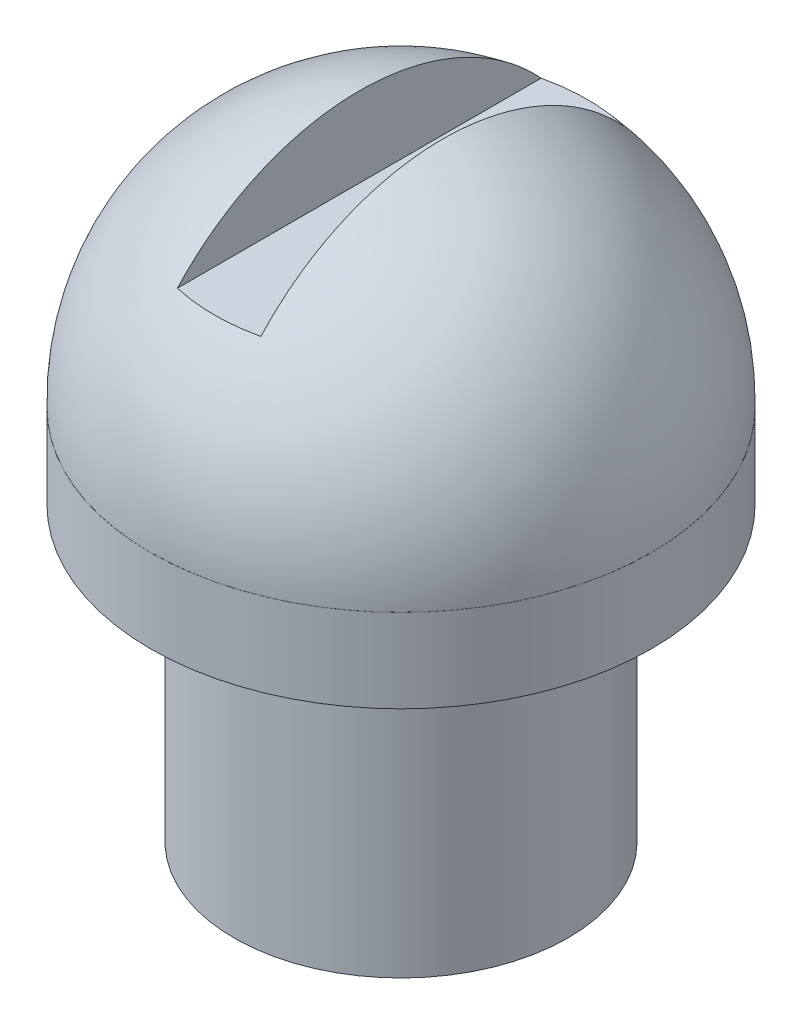
ISO-10303-21;
HEADER;
FILE_DESCRIPTION(('STEP AP214'),'2;1');
FILE_NAME('part.step','',(''),(''),'','','');
FILE_SCHEMA(('AUTOMOTIVE_DESIGN { 1 0 10303 214 1 1 1 1 }'));
ENDSEC;
DATA;
#1=APPLICATION_CONTEXT('core data for automotive mechanical design processes');
#2=APPLICATION_PROTOCOL_DEFINITION('international standard','automotive_design',2000,#1);
#3=PRODUCT_CONTEXT('',#1,'mechanical');
#4=PRODUCT('Part','Part','',(#3));
#5=PRODUCT_RELATED_PRODUCT_CATEGORY('part','',(#4));
#6=PRODUCT_DEFINITION_FORMATION('','',#4);
#7=PRODUCT_DEFINITION_CONTEXT('part definition',#1,'design');
#8=PRODUCT_DEFINITION('design','',#6,#7);
#9=PRODUCT_DEFINITION_SHAPE('','',#8);
#10=(LENGTH_UNIT() NAMED_UNIT(*) SI_UNIT(.MILLI.,.METRE.));
#11=(NAMED_UNIT(*) PLANE_ANGLE_UNIT() SI_UNIT($,.RADIAN.));
#12=(NAMED_UNIT(*) SI_UNIT($,.STERADIAN.) SOLID_ANGLE_UNIT());
#13=UNCERTAINTY_MEASURE_WITH_UNIT(LENGTH_MEASURE(1.E-05),#10,'distance_accuracy_value','');
#14=(GEOMETRIC_REPRESENTATION_CONTEXT(3) GLOBAL_UNCERTAINTY_ASSIGNED_CONTEXT((#13)) GLOBAL_UNIT_ASSIGNED_CONTEXT((#10,
#11,#12)) REPRESENTATION_CONTEXT('',''));
#15=CARTESIAN_POINT('',(0.,0.,0.));
#16=DIRECTION('',(0.,0.,1.));
#17=DIRECTION('',(1.,0.,0.));
#18=AXIS2_PLACEMENT_3D('',#15,#16,#17);
#19=CARTESIAN_POINT('',(0.,0.406467744624105,0.));
#20=DIRECTION('',(0.,-1.,0.));
#21=DIRECTION('',(1.,0.,0.));
#22=AXIS2_PLACEMENT_3D('',#19,#20,#21);
#23=PLANE('',#22);
#24=CARTESIAN_POINT('',(0.,0.406467744624103,0.));
#25=DIRECTION('',(0.,-1.,0.));
#26=DIRECTION('',(1.,0.,0.));
#27=AXIS2_PLACEMENT_3D('',#24,#25,#26);
#28=CIRCLE('',#27,2.00000000000001);
#29=CARTESIAN_POINT('',(2.00000000000001,0.406467744624106,0.));
#30=VERTEX_POINT('',#29);
#31=EDGE_CURVE('E66',#30,#30,#28,.T.);
#32=ORIENTED_EDGE('',*,*,#31,.T.);
#33=EDGE_LOOP('',(#32));
#34=FACE_BOUND('',#33,.T.);
#35=ADVANCED_FACE('F36',(#34),#23,.T.);
#36=CARTESIAN_POINT('',(0.,0.406467744624106,0.));
#37=DIRECTION('',(0.,-1.,0.));
#38=DIRECTION('',(1.,0.,0.));
#39=AXIS2_PLACEMENT_3D('',#36,#37,#38);
#40=CYLINDRICAL_SURFACE('',#39,2.00000000000001);
#41=CARTESIAN_POINT('',(0.,1.4064677446241,0.));
#42=DIRECTION('',(0.,-1.,0.));
#43=DIRECTION('',(1.,0.,0.));
#44=AXIS2_PLACEMENT_3D('',#41,#42,#43);
#45=CIRCLE('',#44,2.00000000000001);
#46=CARTESIAN_POINT('',(2.00000000000001,1.40646774462411,0.));
#47=VERTEX_POINT('',#46);
#48=EDGE_CURVE('E77',#47,#47,#45,.T.);
#49=ORIENTED_EDGE('',*,*,#48,.T.);
#50=EDGE_LOOP('',(#49));
#51=FACE_BOUND('',#50,.T.);
#52=ORIENTED_EDGE('',*,*,#31,.F.);
#53=EDGE_LOOP('',(#52));
#54=FACE_BOUND('',#53,.T.);
#55=ADVANCED_FACE('F108',(#51,#54),#40,.T.);
#56=CARTESIAN_POINT('',(2.00000000000001,1.4064677446241,0.));
#57=DIRECTION('',(0.,-1.,0.));
#58=DIRECTION('',(1.,0.,0.));
#59=AXIS2_PLACEMENT_3D('',#56,#57,#58);
#60=PLANE('',#59);
#61=CARTESIAN_POINT('',(0.,1.4064677446241,0.));
#62=DIRECTION('',(0.,-1.,0.));
#63=DIRECTION('',(1.,0.,0.));
#64=AXIS2_PLACEMENT_3D('',#61,#62,#63);
#65=CIRCLE('',#64,4.00000000000001);
#66=CARTESIAN_POINT('',(4.00000000000001,1.40646774462411,0.));
#67=VERTEX_POINT('',#66);
#68=EDGE_CURVE('E80',#67,#67,#65,.T.);
#69=ORIENTED_EDGE('',*,*,#68,.T.);
#70=EDGE_LOOP('',(#69));
#71=FACE_BOUND('',#70,.T.);
#72=ORIENTED_EDGE('',*,*,#48,.F.);
#73=EDGE_LOOP('',(#72));
#74=FACE_BOUND('',#73,.T.);
#75=ADVANCED_FACE('F113',(#71,#74),#60,.T.);
#76=CARTESIAN_POINT('',(0.,0.406467744624106,0.));
#77=DIRECTION('',(0.,-1.,0.));
#78=DIRECTION('',(1.,0.,0.));
#79=AXIS2_PLACEMENT_3D('',#76,#77,#78);
#80=CYLINDRICAL_SURFACE('',#79,4.00000000000001);
#81=CARTESIAN_POINT('',(0.,8.4064677446241,0.));
#82=DIRECTION('',(0.,-1.,0.));
#83=DIRECTION('',(1.,0.,0.));
#84=AXIS2_PLACEMENT_3D('',#81,#82,#83);
#85=CIRCLE('',#84,4.00000000000002);
#86=CARTESIAN_POINT('',(4.00000000000001,8.40646774462411,0.));
#87=VERTEX_POINT('',#86);
#88=EDGE_CURVE('E83',#87,#87,#85,.T.);
#89=ORIENTED_EDGE('',*,*,#88,.T.);
#90=EDGE_LOOP('',(#89));
#91=FACE_BOUND('',#90,.T.);
#92=ORIENTED_EDGE('',*,*,#68,.F.);
#93=EDGE_LOOP('',(#92));
#94=FACE_BOUND('',#93,.T.);
#95=ADVANCED_FACE('F120',(#91,#94),#80,.T.);
#96=CARTESIAN_POINT('',(4.00000000000001,8.4064677446241,0.));
#97=DIRECTION('',(0.,-1.,0.));
#98=DIRECTION('',(1.,0.,0.));
#99=AXIS2_PLACEMENT_3D('',#96,#97,#98);
#100=PLANE('',#99);
#101=CARTESIAN_POINT('',(0.,8.4064677446241,0.));
#102=DIRECTION('',(0.,-1.,0.));
#103=DIRECTION('',(1.,0.,0.));
#104=AXIS2_PLACEMENT_3D('',#101,#102,#103);
#105=CIRCLE('',#104,6.00000000000002);
#106=CARTESIAN_POINT('',(6.00000000000001,8.40646774462411,0.));
#107=VERTEX_POINT('',#106);
#108=EDGE_CURVE('E86',#107,#107,#105,.T.);
#109=ORIENTED_EDGE('',*,*,#108,.T.);
#110=EDGE_LOOP('',(#109));
#111=FACE_BOUND('',#110,.T.);
#112=ORIENTED_EDGE('',*,*,#88,.F.);
#113=EDGE_LOOP('',(#112));
#114=FACE_BOUND('',#113,.T.);
#115=ADVANCED_FACE('F126',(#111,#114),#100,.T.);
#116=CARTESIAN_POINT('',(0.,0.406467744624106,0.));
#117=DIRECTION('',(0.,-1.,0.));
#118=DIRECTION('',(1.,0.,0.));
#119=AXIS2_PLACEMENT_3D('',#116,#117,#118);
#120=CYLINDRICAL_SURFACE('',#119,6.00000000000002);
#121=CARTESIAN_POINT('',(0.,10.4064677446241,0.));
#122=DIRECTION('',(0.,-1.,0.));
#123=DIRECTION('',(1.,0.,0.));
#124=AXIS2_PLACEMENT_3D('',#121,#122,#123);
#125=CIRCLE('',#124,6.00000000000002);
#126=CARTESIAN_POINT('',(6.00000000000001,10.4064677446241,0.));
#127=VERTEX_POINT('',#126);
#128=EDGE_CURVE('E89',#127,#127,#125,.T.);
#129=ORIENTED_EDGE('',*,*,#128,.T.);
#130=EDGE_LOOP('',(#129));
#131=FACE_BOUND('',#130,.T.);
#132=ORIENTED_EDGE('',*,*,#108,.F.);
#133=EDGE_LOOP('',(#132));
#134=FACE_BOUND('',#133,.T.);
#135=ADVANCED_FACE('F130',(#131,#134),#120,.T.);
#136=CARTESIAN_POINT('',(6.00000000000001,10.4064677446241,0.));
#137=DIRECTION('',(0.,1.,0.));
#138=DIRECTION('',(-1.,0.,0.));
#139=AXIS2_PLACEMENT_3D('',#136,#137,#138);
#140=PLANE('',#139);
#141=CARTESIAN_POINT('',(0.,10.4064677446241,0.));
#142=DIRECTION('',(0.,-1.,0.));
#143=DIRECTION('',(1.,0.,0.));
#144=AXIS2_PLACEMENT_3D('',#141,#142,#143);
#145=CIRCLE('',#144,5.99771317165584);
#146=CARTESIAN_POINT('',(5.99771317165583,10.4064677446241,0.));
#147=VERTEX_POINT('',#146);
#148=EDGE_CURVE('E92',#147,#147,#145,.T.);
#149=ORIENTED_EDGE('',*,*,#148,.T.);
#150=EDGE_LOOP('',(#149));
#151=FACE_BOUND('',#150,.T.);
#152=ORIENTED_EDGE('',*,*,#128,.F.);
#153=EDGE_LOOP('',(#152));
#154=FACE_BOUND('',#153,.T.);
#155=ADVANCED_FACE('F104',(#151,#154),#140,.T.);
#156=CARTESIAN_POINT('',(0.,10.5721080493393,0.));
#157=DIRECTION('',(0.,-1.,0.));
#158=DIRECTION('',(1.,0.,0.));
#159=AXIS2_PLACEMENT_3D('',#156,#157,#158);
#160=SPHERICAL_SURFACE('',#159,6.);
#161=CARTESIAN_POINT('',(1.,10.5721080493393,0.));
#162=DIRECTION('',(1.,0.,0.));
#163=DIRECTION('',(0.,1.,0.));
#164=AXIS2_PLACEMENT_3D('',#161,#162,#163);
#165=CIRCLE('',#164,5.91607978309962);
#166=CARTESIAN_POINT('',(1.,14.5721080493393,4.35889894354067));
#167=VERTEX_POINT('',#166);
#168=CARTESIAN_POINT('',(1.,14.5721080493393,-4.35889894354067));
#169=VERTEX_POINT('',#168);
#170=EDGE_CURVE('E11',#167,#169,#165,.F.);
#171=ORIENTED_EDGE('',*,*,#170,.F.);
#172=CARTESIAN_POINT('',(0.,14.5721080493393,0.));
#173=DIRECTION('',(0.,-1.,0.));
#174=DIRECTION('',(0.,0.,-1.));
#175=AXIS2_PLACEMENT_3D('',#172,#173,#174);
#176=CIRCLE('',#175,4.47213595499957);
#177=CARTESIAN_POINT('',(-1.,14.5721080493393,4.35889894354067));
#178=VERTEX_POINT('',#177);
#179=EDGE_CURVE('E43',#178,#167,#176,.F.);
#180=ORIENTED_EDGE('',*,*,#179,.F.);
#181=CARTESIAN_POINT('',(-0.999999999999999,10.5721080493393,0.));
#182=DIRECTION('',(-1.,0.,0.));
#183=DIRECTION('',(0.,-1.,0.));
#184=AXIS2_PLACEMENT_3D('',#181,#182,#183);
#185=CIRCLE('',#184,5.91607978309962);
#186=CARTESIAN_POINT('',(-1.,14.5721080493393,-4.35889894354067));
#187=VERTEX_POINT('',#186);
#188=EDGE_CURVE('E61',#187,#178,#185,.F.);
#189=ORIENTED_EDGE('',*,*,#188,.F.);
#190=EDGE_CURVE('E65',#169,#187,#176,.F.);
#191=ORIENTED_EDGE('',*,*,#190,.F.);
#192=EDGE_LOOP('',(#171,#180,#189,#191));
#193=FACE_BOUND('',#192,.T.);
#194=ORIENTED_EDGE('',*,*,#148,.F.);
#195=EDGE_LOOP('',(#194));
#196=FACE_BOUND('',#195,.T.);
#197=ADVANCED_FACE('F72',(#193,#196),#160,.T.);
#198=CARTESIAN_POINT('',(1.,18.5721080493393,-5.));
#199=DIRECTION('',(1.,0.,0.));
#200=DIRECTION('',(0.,1.,0.));
#201=AXIS2_PLACEMENT_3D('',#198,#199,#200);
#202=PLANE('',#201);
#203=ORIENTED_EDGE('',*,*,#170,.T.);
#204=DIRECTION('',(0.,0.,1.));
#205=VECTOR('',#204,1.);
#206=CARTESIAN_POINT('',(1.,14.5721080493393,-5.));
#207=LINE('',#206,#205);
#208=EDGE_CURVE('E69',#169,#167,#207,.T.);
#209=ORIENTED_EDGE('',*,*,#208,.T.);
#210=EDGE_LOOP('',(#203,#209));
#211=FACE_BOUND('',#210,.T.);
#212=ADVANCED_FACE('F96',(#211),#202,.F.);
#213=CARTESIAN_POINT('',(-1.,14.5721080493393,-5.));
#214=DIRECTION('',(0.,-1.,0.));
#215=DIRECTION('',(0.,0.,-1.));
#216=AXIS2_PLACEMENT_3D('',#213,#214,#215);
#217=PLANE('',#216);
#218=ORIENTED_EDGE('',*,*,#179,.T.);
#219=ORIENTED_EDGE('',*,*,#208,.F.);
#220=ORIENTED_EDGE('',*,*,#190,.T.);
#221=DIRECTION('',(0.,0.,1.));
#222=VECTOR('',#221,1.);
#223=CARTESIAN_POINT('',(-1.,14.5721080493393,-5.));
#224=LINE('',#223,#222);
#225=EDGE_CURVE('E49',#187,#178,#224,.T.);
#226=ORIENTED_EDGE('',*,*,#225,.T.);
#227=EDGE_LOOP('',(#218,#219,#220,#226));
#228=FACE_BOUND('',#227,.T.);
#229=ADVANCED_FACE('F68',(#228),#217,.F.);
#230=CARTESIAN_POINT('',(-1.,18.5721080493393,-5.));
#231=DIRECTION('',(-1.,0.,0.));
#232=DIRECTION('',(0.,-1.,0.));
#233=AXIS2_PLACEMENT_3D('',#230,#231,#232);
#234=PLANE('',#233);
#235=ORIENTED_EDGE('',*,*,#188,.T.);
#236=ORIENTED_EDGE('',*,*,#225,.F.);
#237=EDGE_LOOP('',(#235,#236));
#238=FACE_BOUND('',#237,.T.);
#239=ADVANCED_FACE('F62',(#238),#234,.F.);
#240=CLOSED_SHELL('',(#35,#55,#75,#95,#115,#135,#155,#197,#212,#229,#239));
#241=MANIFOLD_SOLID_BREP('B2',#240);
#242=ADVANCED_BREP_SHAPE_REPRESENTATION('',(#18,#241),#14);
#243=SHAPE_DEFINITION_REPRESENTATION(#9,#242);
ENDSEC;
END-ISO-10303-21;
